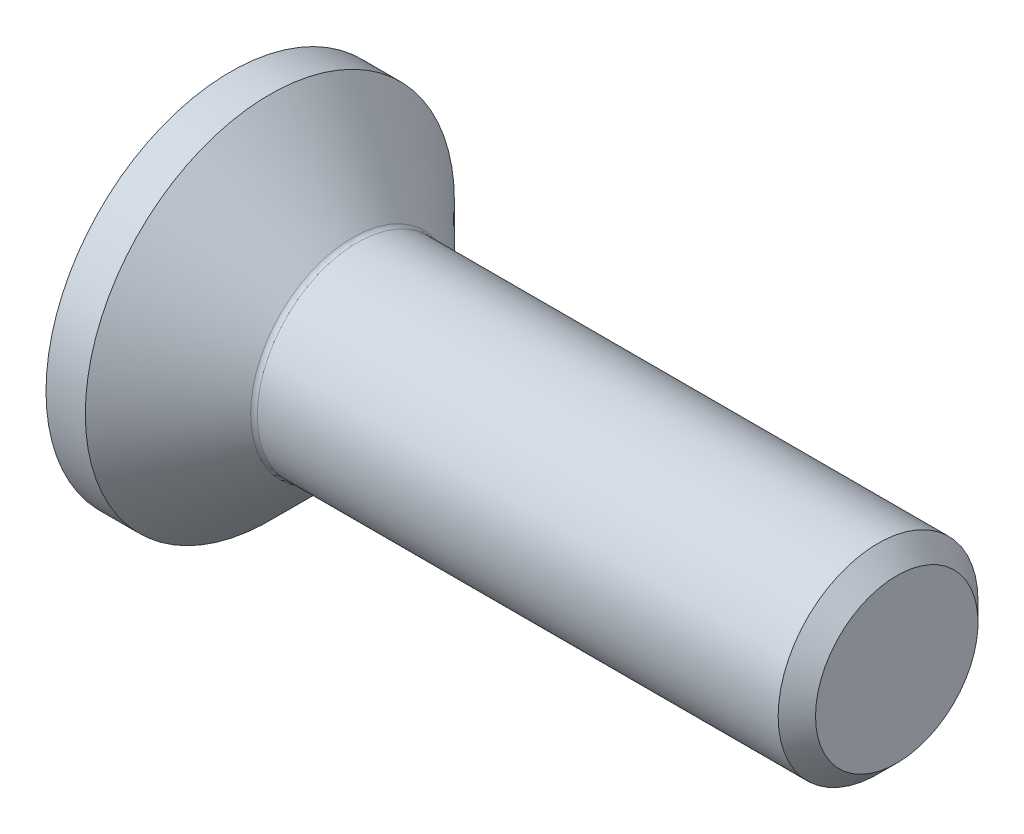
ISO-10303-21;
HEADER;
FILE_DESCRIPTION(('STEP AP214'),'2;1');
FILE_NAME('part.step','',(''),(''),'','','');
FILE_SCHEMA(('AUTOMOTIVE_DESIGN { 1 0 10303 214 1 1 1 1 }'));
ENDSEC;
DATA;
#1=APPLICATION_CONTEXT('core data for automotive mechanical design processes');
#2=APPLICATION_PROTOCOL_DEFINITION('international standard','automotive_design',2000,#1);
#3=PRODUCT_CONTEXT('',#1,'mechanical');
#4=PRODUCT('Part','Part','',(#3));
#5=PRODUCT_RELATED_PRODUCT_CATEGORY('part','',(#4));
#6=PRODUCT_DEFINITION_FORMATION('','',#4);
#7=PRODUCT_DEFINITION_CONTEXT('part definition',#1,'design');
#8=PRODUCT_DEFINITION('design','',#6,#7);
#9=PRODUCT_DEFINITION_SHAPE('','',#8);
#10=(LENGTH_UNIT() NAMED_UNIT(*) SI_UNIT(.MILLI.,.METRE.));
#11=(NAMED_UNIT(*) PLANE_ANGLE_UNIT() SI_UNIT($,.RADIAN.));
#12=(NAMED_UNIT(*) SI_UNIT($,.STERADIAN.) SOLID_ANGLE_UNIT());
#13=UNCERTAINTY_MEASURE_WITH_UNIT(LENGTH_MEASURE(1.E-05),#10,'distance_accuracy_value','');
#14=(GEOMETRIC_REPRESENTATION_CONTEXT(3) GLOBAL_UNCERTAINTY_ASSIGNED_CONTEXT((#13)) GLOBAL_UNIT_ASSIGNED_CONTEXT((#10,
#11,#12)) REPRESENTATION_CONTEXT('',''));
#15=CARTESIAN_POINT('',(0.,0.,0.));
#16=DIRECTION('',(0.,0.,1.));
#17=DIRECTION('',(1.,0.,0.));
#18=AXIS2_PLACEMENT_3D('',#15,#16,#17);
#19=CARTESIAN_POINT('',(0.,0.,0.));
#20=DIRECTION('',(-1.,0.,0.));
#21=DIRECTION('',(0.,0.,1.));
#22=AXIS2_PLACEMENT_3D('',#19,#20,#21);
#23=PLANE('',#22);
#24=CARTESIAN_POINT('',(0.,0.,0.));
#25=DIRECTION('',(-1.,0.,0.));
#26=DIRECTION('',(0.,0.,1.));
#27=AXIS2_PLACEMENT_3D('',#24,#25,#26);
#28=CIRCLE('',#27,2.77);
#29=CARTESIAN_POINT('',(0.,0.,2.77));
#30=VERTEX_POINT('',#29);
#31=EDGE_CURVE('E155',#30,#30,#28,.T.);
#32=ORIENTED_EDGE('',*,*,#31,.T.);
#33=EDGE_LOOP('',(#32));
#34=FACE_BOUND('',#33,.T.);
#35=DIRECTION('',(0.,-0.499999999999998,-0.86602540378444));
#36=VECTOR('',#35,1.);
#37=CARTESIAN_POINT('',(0.,-0.577350269189626,1.));
#38=LINE('',#37,#36);
#39=CARTESIAN_POINT('',(0.,-0.577350269189626,1.));
#40=VERTEX_POINT('',#39);
#41=CARTESIAN_POINT('',(0.,-1.15470053837925,0.));
#42=VERTEX_POINT('',#41);
#43=EDGE_CURVE('E121',#40,#42,#38,.T.);
#44=ORIENTED_EDGE('',*,*,#43,.T.);
#45=DIRECTION('',(0.,0.499999999999999,-0.866025403784439));
#46=VECTOR('',#45,1.);
#47=CARTESIAN_POINT('',(0.,-1.15470053837925,0.));
#48=LINE('',#47,#46);
#49=CARTESIAN_POINT('',(0.,-0.577350269189625,-1.));
#50=VERTEX_POINT('',#49);
#51=EDGE_CURVE('E52',#42,#50,#48,.T.);
#52=ORIENTED_EDGE('',*,*,#51,.T.);
#53=DIRECTION('',(0.,1.,0.));
#54=VECTOR('',#53,1.);
#55=CARTESIAN_POINT('',(0.,-0.577350269189625,-1.));
#56=LINE('',#55,#54);
#57=CARTESIAN_POINT('',(0.,0.577350269189626,-1.));
#58=VERTEX_POINT('',#57);
#59=EDGE_CURVE('E132',#50,#58,#56,.T.);
#60=ORIENTED_EDGE('',*,*,#59,.T.);
#61=DIRECTION('',(0.,0.5,0.866025403784439));
#62=VECTOR('',#61,1.);
#63=CARTESIAN_POINT('',(0.,0.577350269189626,-1.));
#64=LINE('',#63,#62);
#65=CARTESIAN_POINT('',(0.,1.15470053837925,0.));
#66=VERTEX_POINT('',#65);
#67=EDGE_CURVE('E256',#58,#66,#64,.T.);
#68=ORIENTED_EDGE('',*,*,#67,.T.);
#69=DIRECTION('',(0.,-0.499999999999999,0.866025403784439));
#70=VECTOR('',#69,1.);
#71=CARTESIAN_POINT('',(0.,1.15470053837925,0.));
#72=LINE('',#71,#70);
#73=CARTESIAN_POINT('',(0.,0.577350269189625,0.999999999999999));
#74=VERTEX_POINT('',#73);
#75=EDGE_CURVE('E259',#66,#74,#72,.T.);
#76=ORIENTED_EDGE('',*,*,#75,.T.);
#77=DIRECTION('',(0.,-1.,0.));
#78=VECTOR('',#77,1.);
#79=CARTESIAN_POINT('',(0.,0.577350269189625,0.999999999999999));
#80=LINE('',#79,#78);
#81=EDGE_CURVE('E262',#74,#40,#80,.T.);
#82=ORIENTED_EDGE('',*,*,#81,.T.);
#83=EDGE_LOOP('',(#44,#52,#60,#68,#76,#82));
#84=FACE_BOUND('',#83,.T.);
#85=ADVANCED_FACE('F37',(#34,#84),#23,.T.);
#86=CARTESIAN_POINT('',(0.,0.,0.));
#87=DIRECTION('',(-1.,0.,0.));
#88=DIRECTION('',(0.,0.,1.));
#89=AXIS2_PLACEMENT_3D('',#86,#87,#88);
#90=CYLINDRICAL_SURFACE('',#89,2.77);
#91=CARTESIAN_POINT('',(0.590000000000013,0.,0.));
#92=DIRECTION('',(-1.,0.,0.));
#93=DIRECTION('',(0.,0.,1.));
#94=AXIS2_PLACEMENT_3D('',#91,#92,#93);
#95=CIRCLE('',#94,2.77);
#96=CARTESIAN_POINT('',(0.590000000000013,0.,2.77));
#97=VERTEX_POINT('',#96);
#98=EDGE_CURVE('E152',#97,#97,#95,.T.);
#99=ORIENTED_EDGE('',*,*,#98,.T.);
#100=EDGE_LOOP('',(#99));
#101=FACE_BOUND('',#100,.T.);
#102=ORIENTED_EDGE('',*,*,#31,.F.);
#103=EDGE_LOOP('',(#102));
#104=FACE_BOUND('',#103,.T.);
#105=ADVANCED_FACE('F176',(#101,#104),#90,.T.);
#106=CARTESIAN_POINT('',(0.590000000000013,0.,0.));
#107=DIRECTION('',(-1.,0.,0.));
#108=DIRECTION('',(0.,0.,1.));
#109=AXIS2_PLACEMENT_3D('',#106,#107,#108);
#110=CONICAL_SURFACE('',#109,2.77,0.785398163397451);
#111=CARTESIAN_POINT('',(1.83071067811866,0.,0.));
#112=DIRECTION('',(-1.,0.,0.));
#113=DIRECTION('',(0.,0.,1.));
#114=AXIS2_PLACEMENT_3D('',#111,#112,#113);
#115=CIRCLE('',#114,1.52928932188135);
#116=CARTESIAN_POINT('',(1.83071067811866,0.,1.52928932188135));
#117=VERTEX_POINT('',#116);
#118=EDGE_CURVE('E45',#117,#117,#115,.T.);
#119=ORIENTED_EDGE('',*,*,#118,.T.);
#120=EDGE_LOOP('',(#119));
#121=FACE_BOUND('',#120,.T.);
#122=ORIENTED_EDGE('',*,*,#98,.F.);
#123=EDGE_LOOP('',(#122));
#124=FACE_BOUND('',#123,.T.);
#125=ADVANCED_FACE('F160',(#121,#124),#110,.T.);
#126=CARTESIAN_POINT('',(0.,0.,0.));
#127=DIRECTION('',(-1.,0.,0.));
#128=DIRECTION('',(0.,0.,1.));
#129=AXIS2_PLACEMENT_3D('',#126,#127,#128);
#130=CYLINDRICAL_SURFACE('',#129,1.5);
#131=CARTESIAN_POINT('',(1.90142135623731,0.,0.));
#132=DIRECTION('',(-1.,0.,0.));
#133=DIRECTION('',(0.,0.,1.));
#134=AXIS2_PLACEMENT_3D('',#131,#132,#133);
#135=CIRCLE('',#134,1.5);
#136=CARTESIAN_POINT('',(1.90142135623731,0.,1.5));
#137=VERTEX_POINT('',#136);
#138=EDGE_CURVE('E11',#137,#137,#135,.F.);
#139=ORIENTED_EDGE('',*,*,#138,.T.);
#140=EDGE_LOOP('',(#139));
#141=FACE_BOUND('',#140,.T.);
#142=CARTESIAN_POINT('',(9.71949999999999,0.,0.));
#143=DIRECTION('',(-1.,0.,0.));
#144=DIRECTION('',(0.,0.,1.));
#145=AXIS2_PLACEMENT_3D('',#142,#143,#144);
#146=CIRCLE('',#145,1.5);
#147=CARTESIAN_POINT('',(9.71949999999999,0.,1.5));
#148=VERTEX_POINT('',#147);
#149=EDGE_CURVE('E149',#148,#148,#146,.T.);
#150=ORIENTED_EDGE('',*,*,#149,.T.);
#151=EDGE_LOOP('',(#150));
#152=FACE_BOUND('',#151,.T.);
#153=ADVANCED_FACE('F187',(#141,#152),#130,.T.);
#154=CARTESIAN_POINT('',(9.99999999999999,0.,0.));
#155=DIRECTION('',(-1.,0.,0.));
#156=DIRECTION('',(0.,0.,1.));
#157=AXIS2_PLACEMENT_3D('',#154,#155,#156);
#158=CONICAL_SURFACE('',#157,1.2195,0.785398163397448);
#159=ORIENTED_EDGE('',*,*,#149,.F.);
#160=EDGE_LOOP('',(#159));
#161=FACE_BOUND('',#160,.T.);
#162=CARTESIAN_POINT('',(9.99999999999999,0.,0.));
#163=DIRECTION('',(-1.,0.,0.));
#164=DIRECTION('',(0.,0.,1.));
#165=AXIS2_PLACEMENT_3D('',#162,#163,#164);
#166=CIRCLE('',#165,1.2195);
#167=CARTESIAN_POINT('',(9.99999999999999,0.,1.2195));
#168=VERTEX_POINT('',#167);
#169=EDGE_CURVE('E145',#168,#168,#166,.T.);
#170=ORIENTED_EDGE('',*,*,#169,.T.);
#171=EDGE_LOOP('',(#170));
#172=FACE_BOUND('',#171,.T.);
#173=ADVANCED_FACE('F171',(#161,#172),#158,.T.);
#174=CARTESIAN_POINT('',(9.99999999999999,1.2195,0.));
#175=DIRECTION('',(1.,0.,0.));
#176=DIRECTION('',(0.,0.,-1.));
#177=AXIS2_PLACEMENT_3D('',#174,#175,#176);
#178=PLANE('',#177);
#179=ORIENTED_EDGE('',*,*,#169,.F.);
#180=EDGE_LOOP('',(#179));
#181=FACE_BOUND('',#180,.T.);
#182=ADVANCED_FACE('F164',(#181),#178,.T.);
#183=CARTESIAN_POINT('',(1.90142135623731,0.,0.));
#184=DIRECTION('',(-1.,0.,0.));
#185=DIRECTION('',(0.,0.,1.));
#186=AXIS2_PLACEMENT_3D('',#183,#184,#185);
#187=TOROIDAL_SURFACE('',#186,1.6,0.1);
#188=ORIENTED_EDGE('',*,*,#138,.F.);
#189=EDGE_LOOP('',(#188));
#190=FACE_BOUND('',#189,.T.);
#191=ORIENTED_EDGE('',*,*,#118,.F.);
#192=EDGE_LOOP('',(#191));
#193=FACE_BOUND('',#192,.T.);
#194=ADVANCED_FACE('F39',(#190,#193),#187,.F.);
#195=CARTESIAN_POINT('',(1.1,-1.15470053837925,0.));
#196=DIRECTION('',(0.,0.866025403784439,0.499999999999999));
#197=DIRECTION('',(0.,-0.499999999999999,0.866025403784439));
#198=AXIS2_PLACEMENT_3D('',#195,#196,#197);
#199=PLANE('',#198);
#200=ORIENTED_EDGE('',*,*,#51,.F.);
#201=DIRECTION('',(-1.,0.,0.));
#202=VECTOR('',#201,1.);
#203=CARTESIAN_POINT('',(1.1,-1.15470053837925,0.));
#204=LINE('',#203,#202);
#205=CARTESIAN_POINT('',(1.1,-1.15470053837925,0.));
#206=VERTEX_POINT('',#205);
#207=EDGE_CURVE('E253',#206,#42,#204,.T.);
#208=ORIENTED_EDGE('',*,*,#207,.F.);
#209=DIRECTION('',(0.,0.499999999999999,-0.866025403784439));
#210=VECTOR('',#209,1.);
#211=CARTESIAN_POINT('',(1.1,-1.15470053837925,0.));
#212=LINE('',#211,#210);
#213=CARTESIAN_POINT('',(1.1,-0.866025403784438,-0.499999999999998));
#214=VERTEX_POINT('',#213);
#215=EDGE_CURVE('E117',#206,#214,#212,.T.);
#216=ORIENTED_EDGE('',*,*,#215,.T.);
#217=CARTESIAN_POINT('',(1.1,-0.577350269189625,-1.));
#218=VERTEX_POINT('',#217);
#219=EDGE_CURVE('E113',#214,#218,#212,.T.);
#220=ORIENTED_EDGE('',*,*,#219,.T.);
#221=DIRECTION('',(-1.,0.,0.));
#222=VECTOR('',#221,1.);
#223=CARTESIAN_POINT('',(1.1,-0.577350269189625,-1.));
#224=LINE('',#223,#222);
#225=EDGE_CURVE('E115',#218,#50,#224,.T.);
#226=ORIENTED_EDGE('',*,*,#225,.T.);
#227=EDGE_LOOP('',(#200,#208,#216,#220,#226));
#228=FACE_BOUND('',#227,.T.);
#229=ADVANCED_FACE('F114',(#228),#199,.T.);
#230=CARTESIAN_POINT('',(1.1,-0.577350269189625,-1.));
#231=DIRECTION('',(0.,0.,1.));
#232=DIRECTION('',(1.,0.,0.));
#233=AXIS2_PLACEMENT_3D('',#230,#231,#232);
#234=PLANE('',#233);
#235=ORIENTED_EDGE('',*,*,#59,.F.);
#236=ORIENTED_EDGE('',*,*,#225,.F.);
#237=DIRECTION('',(0.,1.,0.));
#238=VECTOR('',#237,1.);
#239=CARTESIAN_POINT('',(1.1,-0.577350269189625,-1.));
#240=LINE('',#239,#238);
#241=CARTESIAN_POINT('',(1.1,0.,-1.));
#242=VERTEX_POINT('',#241);
#243=EDGE_CURVE('E60',#218,#242,#240,.T.);
#244=ORIENTED_EDGE('',*,*,#243,.T.);
#245=CARTESIAN_POINT('',(1.1,0.577350269189626,-1.));
#246=VERTEX_POINT('',#245);
#247=EDGE_CURVE('E127',#242,#246,#240,.T.);
#248=ORIENTED_EDGE('',*,*,#247,.T.);
#249=DIRECTION('',(-1.,0.,0.));
#250=VECTOR('',#249,1.);
#251=CARTESIAN_POINT('',(1.1,0.577350269189626,-1.));
#252=LINE('',#251,#250);
#253=EDGE_CURVE('E134',#246,#58,#252,.T.);
#254=ORIENTED_EDGE('',*,*,#253,.T.);
#255=EDGE_LOOP('',(#235,#236,#244,#248,#254));
#256=FACE_BOUND('',#255,.T.);
#257=ADVANCED_FACE('F129',(#256),#234,.T.);
#258=CARTESIAN_POINT('',(1.1,0.577350269189626,-1.));
#259=DIRECTION('',(0.,-0.866025403784438,0.5));
#260=DIRECTION('',(0.,-0.5,-0.866025403784439));
#261=AXIS2_PLACEMENT_3D('',#258,#259,#260);
#262=PLANE('',#261);
#263=ORIENTED_EDGE('',*,*,#67,.F.);
#264=ORIENTED_EDGE('',*,*,#253,.F.);
#265=DIRECTION('',(0.,0.5,0.866025403784439));
#266=VECTOR('',#265,1.);
#267=CARTESIAN_POINT('',(1.1,0.577350269189626,-1.));
#268=LINE('',#267,#266);
#269=CARTESIAN_POINT('',(1.1,0.866025403784439,-0.5));
#270=VERTEX_POINT('',#269);
#271=EDGE_CURVE('E234',#246,#270,#268,.T.);
#272=ORIENTED_EDGE('',*,*,#271,.T.);
#273=CARTESIAN_POINT('',(1.1,1.15470053837925,0.));
#274=VERTEX_POINT('',#273);
#275=EDGE_CURVE('E126',#270,#274,#268,.T.);
#276=ORIENTED_EDGE('',*,*,#275,.T.);
#277=DIRECTION('',(-1.,0.,0.));
#278=VECTOR('',#277,1.);
#279=CARTESIAN_POINT('',(1.1,1.15470053837925,0.));
#280=LINE('',#279,#278);
#281=EDGE_CURVE('E140',#274,#66,#280,.T.);
#282=ORIENTED_EDGE('',*,*,#281,.T.);
#283=EDGE_LOOP('',(#263,#264,#272,#276,#282));
#284=FACE_BOUND('',#283,.T.);
#285=ADVANCED_FACE('F201',(#284),#262,.T.);
#286=CARTESIAN_POINT('',(1.1,1.15470053837925,0.));
#287=DIRECTION('',(0.,-0.866025403784439,-0.499999999999999));
#288=DIRECTION('',(0.,0.499999999999999,-0.866025403784439));
#289=AXIS2_PLACEMENT_3D('',#286,#287,#288);
#290=PLANE('',#289);
#291=ORIENTED_EDGE('',*,*,#75,.F.);
#292=ORIENTED_EDGE('',*,*,#281,.F.);
#293=DIRECTION('',(0.,-0.499999999999999,0.866025403784439));
#294=VECTOR('',#293,1.);
#295=CARTESIAN_POINT('',(1.1,1.15470053837925,0.));
#296=LINE('',#295,#294);
#297=CARTESIAN_POINT('',(1.1,0.866025403784438,0.499999999999999));
#298=VERTEX_POINT('',#297);
#299=EDGE_CURVE('E241',#274,#298,#296,.T.);
#300=ORIENTED_EDGE('',*,*,#299,.T.);
#301=CARTESIAN_POINT('',(1.1,0.577350269189625,0.999999999999999));
#302=VERTEX_POINT('',#301);
#303=EDGE_CURVE('E239',#298,#302,#296,.T.);
#304=ORIENTED_EDGE('',*,*,#303,.T.);
#305=DIRECTION('',(-1.,0.,0.));
#306=VECTOR('',#305,1.);
#307=CARTESIAN_POINT('',(1.1,0.577350269189625,0.999999999999999));
#308=LINE('',#307,#306);
#309=EDGE_CURVE('E271',#302,#74,#308,.T.);
#310=ORIENTED_EDGE('',*,*,#309,.T.);
#311=EDGE_LOOP('',(#291,#292,#300,#304,#310));
#312=FACE_BOUND('',#311,.T.);
#313=ADVANCED_FACE('F204',(#312),#290,.T.);
#314=CARTESIAN_POINT('',(1.1,0.577350269189625,0.999999999999999));
#315=DIRECTION('',(0.,0.,-1.));
#316=DIRECTION('',(0.,1.,0.));
#317=AXIS2_PLACEMENT_3D('',#314,#315,#316);
#318=PLANE('',#317);
#319=ORIENTED_EDGE('',*,*,#81,.F.);
#320=ORIENTED_EDGE('',*,*,#309,.F.);
#321=DIRECTION('',(0.,-1.,0.));
#322=VECTOR('',#321,1.);
#323=CARTESIAN_POINT('',(1.1,0.577350269189625,0.999999999999999));
#324=LINE('',#323,#322);
#325=CARTESIAN_POINT('',(1.1,0.,1.));
#326=VERTEX_POINT('',#325);
#327=EDGE_CURVE('E246',#302,#326,#324,.T.);
#328=ORIENTED_EDGE('',*,*,#327,.T.);
#329=CARTESIAN_POINT('',(1.1,-0.577350269189626,1.));
#330=VERTEX_POINT('',#329);
#331=EDGE_CURVE('E245',#326,#330,#324,.T.);
#332=ORIENTED_EDGE('',*,*,#331,.T.);
#333=DIRECTION('',(-1.,0.,0.));
#334=VECTOR('',#333,1.);
#335=CARTESIAN_POINT('',(1.1,-0.577350269189626,1.));
#336=LINE('',#335,#334);
#337=EDGE_CURVE('E268',#330,#40,#336,.T.);
#338=ORIENTED_EDGE('',*,*,#337,.T.);
#339=EDGE_LOOP('',(#319,#320,#328,#332,#338));
#340=FACE_BOUND('',#339,.T.);
#341=ADVANCED_FACE('F208',(#340),#318,.T.);
#342=CARTESIAN_POINT('',(1.1,-0.577350269189626,1.));
#343=DIRECTION('',(0.,0.86602540378444,-0.499999999999998));
#344=DIRECTION('',(0.,0.499999999999998,0.86602540378444));
#345=AXIS2_PLACEMENT_3D('',#342,#343,#344);
#346=PLANE('',#345);
#347=ORIENTED_EDGE('',*,*,#43,.F.);
#348=ORIENTED_EDGE('',*,*,#337,.F.);
#349=DIRECTION('',(0.,-0.499999999999998,-0.86602540378444));
#350=VECTOR('',#349,1.);
#351=CARTESIAN_POINT('',(1.1,-0.577350269189626,1.));
#352=LINE('',#351,#350);
#353=CARTESIAN_POINT('',(1.1,-0.866025403784439,0.499999999999997));
#354=VERTEX_POINT('',#353);
#355=EDGE_CURVE('E250',#330,#354,#352,.T.);
#356=ORIENTED_EDGE('',*,*,#355,.T.);
#357=EDGE_CURVE('E249',#354,#206,#352,.T.);
#358=ORIENTED_EDGE('',*,*,#357,.T.);
#359=ORIENTED_EDGE('',*,*,#207,.T.);
#360=EDGE_LOOP('',(#347,#348,#356,#358,#359));
#361=FACE_BOUND('',#360,.T.);
#362=ADVANCED_FACE('F212',(#361),#346,.T.);
#363=CARTESIAN_POINT('',(1.1,-0.577350269189626,-1.));
#364=DIRECTION('',(1.,0.,0.));
#365=DIRECTION('',(0.,0.,-1.));
#366=AXIS2_PLACEMENT_3D('',#363,#364,#365);
#367=PLANE('',#366);
#368=ORIENTED_EDGE('',*,*,#243,.F.);
#369=ORIENTED_EDGE('',*,*,#219,.F.);
#370=CARTESIAN_POINT('',(1.1,0.,0.));
#371=DIRECTION('',(-1.,0.,0.));
#372=DIRECTION('',(0.,0.,1.));
#373=AXIS2_PLACEMENT_3D('',#370,#371,#372);
#374=CIRCLE('',#373,1.);
#375=EDGE_CURVE('E124',#242,#214,#374,.T.);
#376=ORIENTED_EDGE('',*,*,#375,.F.);
#377=EDGE_LOOP('',(#368,#369,#376));
#378=FACE_BOUND('',#377,.T.);
#379=ADVANCED_FACE('F123',(#378),#367,.F.);
#380=ORIENTED_EDGE('',*,*,#215,.F.);
#381=ORIENTED_EDGE('',*,*,#357,.F.);
#382=EDGE_CURVE('E137',#214,#354,#374,.T.);
#383=ORIENTED_EDGE('',*,*,#382,.F.);
#384=EDGE_LOOP('',(#380,#381,#383));
#385=FACE_BOUND('',#384,.T.);
#386=ADVANCED_FACE('F218',(#385),#367,.F.);
#387=ORIENTED_EDGE('',*,*,#355,.F.);
#388=ORIENTED_EDGE('',*,*,#331,.F.);
#389=EDGE_CURVE('E133',#354,#326,#374,.T.);
#390=ORIENTED_EDGE('',*,*,#389,.F.);
#391=EDGE_LOOP('',(#387,#388,#390));
#392=FACE_BOUND('',#391,.T.);
#393=ADVANCED_FACE('F222',(#392),#367,.F.);
#394=ORIENTED_EDGE('',*,*,#327,.F.);
#395=ORIENTED_EDGE('',*,*,#303,.F.);
#396=EDGE_CURVE('E139',#326,#298,#374,.T.);
#397=ORIENTED_EDGE('',*,*,#396,.F.);
#398=EDGE_LOOP('',(#394,#395,#397));
#399=FACE_BOUND('',#398,.T.);
#400=ADVANCED_FACE('F230',(#399),#367,.F.);
#401=ORIENTED_EDGE('',*,*,#299,.F.);
#402=ORIENTED_EDGE('',*,*,#275,.F.);
#403=EDGE_CURVE('E146',#298,#270,#374,.T.);
#404=ORIENTED_EDGE('',*,*,#403,.F.);
#405=EDGE_LOOP('',(#401,#402,#404));
#406=FACE_BOUND('',#405,.T.);
#407=ADVANCED_FACE('F225',(#406),#367,.F.);
#408=ORIENTED_EDGE('',*,*,#271,.F.);
#409=ORIENTED_EDGE('',*,*,#247,.F.);
#410=EDGE_CURVE('E235',#270,#242,#374,.T.);
#411=ORIENTED_EDGE('',*,*,#410,.F.);
#412=EDGE_LOOP('',(#408,#409,#411));
#413=FACE_BOUND('',#412,.T.);
#414=ADVANCED_FACE('F196',(#413),#367,.F.);
#415=CARTESIAN_POINT('',(1.1,0.,0.));
#416=DIRECTION('',(-1.,0.,0.));
#417=DIRECTION('',(0.,0.,1.));
#418=AXIS2_PLACEMENT_3D('',#415,#416,#417);
#419=CONICAL_SURFACE('',#418,1.,1.04719755119659);
#420=CARTESIAN_POINT('',(1.67735026918963,0.,0.));
#421=VERTEX_POINT('',#420);
#422=VERTEX_LOOP('',#421);
#423=FACE_BOUND('',#422,.T.);
#424=ORIENTED_EDGE('',*,*,#396,.T.);
#425=ORIENTED_EDGE('',*,*,#403,.T.);
#426=ORIENTED_EDGE('',*,*,#410,.T.);
#427=ORIENTED_EDGE('',*,*,#375,.T.);
#428=ORIENTED_EDGE('',*,*,#382,.T.);
#429=ORIENTED_EDGE('',*,*,#389,.T.);
#430=EDGE_LOOP('',(#424,#425,#426,#427,#428,#429));
#431=FACE_BOUND('',#430,.T.);
#432=ADVANCED_FACE('F194',(#423,#431),#419,.F.);
#433=CLOSED_SHELL('',(#85,#105,#125,#153,#173,#182,#194,#229,#257,#285,#313,#341,#362,#379,#386,
#393,#400,#407,#414,#432));
#434=MANIFOLD_SOLID_BREP('B2',#433);
#435=ADVANCED_BREP_SHAPE_REPRESENTATION('',(#18,#434),#14);
#436=SHAPE_DEFINITION_REPRESENTATION(#9,#435);
ENDSEC;
END-ISO-10303-21;
